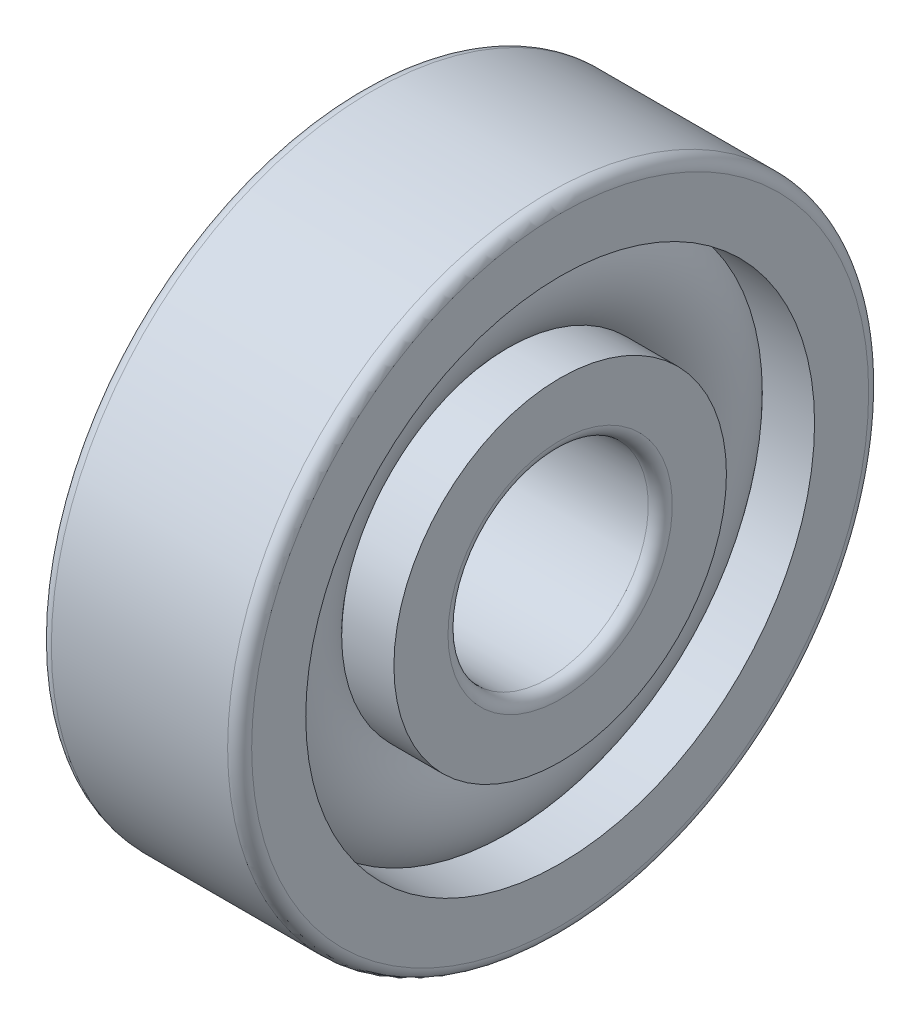
ISO-10303-21;
HEADER;
FILE_DESCRIPTION(('STEP AP214'),'2;1');
FILE_NAME('part.step','',(''),(''),'','','');
FILE_SCHEMA(('AUTOMOTIVE_DESIGN { 1 0 10303 214 1 1 1 1 }'));
ENDSEC;
DATA;
#1=APPLICATION_CONTEXT('core data for automotive mechanical design processes');
#2=APPLICATION_PROTOCOL_DEFINITION('international standard','automotive_design',2000,#1);
#3=PRODUCT_CONTEXT('',#1,'mechanical');
#4=PRODUCT('Part','Part','',(#3));
#5=PRODUCT_RELATED_PRODUCT_CATEGORY('part','',(#4));
#6=PRODUCT_DEFINITION_FORMATION('','',#4);
#7=PRODUCT_DEFINITION_CONTEXT('part definition',#1,'design');
#8=PRODUCT_DEFINITION('design','',#6,#7);
#9=PRODUCT_DEFINITION_SHAPE('','',#8);
#10=(LENGTH_UNIT() NAMED_UNIT(*) SI_UNIT(.MILLI.,.METRE.));
#11=(NAMED_UNIT(*) PLANE_ANGLE_UNIT() SI_UNIT($,.RADIAN.));
#12=(NAMED_UNIT(*) SI_UNIT($,.STERADIAN.) SOLID_ANGLE_UNIT());
#13=UNCERTAINTY_MEASURE_WITH_UNIT(LENGTH_MEASURE(1.E-05),#10,'distance_accuracy_value','');
#14=(GEOMETRIC_REPRESENTATION_CONTEXT(3) GLOBAL_UNCERTAINTY_ASSIGNED_CONTEXT((#13)) GLOBAL_UNIT_ASSIGNED_CONTEXT((#10,
#11,#12)) REPRESENTATION_CONTEXT('',''));
#15=CARTESIAN_POINT('',(0.,0.,0.));
#16=DIRECTION('',(0.,0.,1.));
#17=DIRECTION('',(1.,0.,0.));
#18=AXIS2_PLACEMENT_3D('',#15,#16,#17);
#19=CARTESIAN_POINT('',(0.,0.,0.));
#20=DIRECTION('',(1.,0.,0.));
#21=DIRECTION('',(0.,0.,-1.));
#22=AXIS2_PLACEMENT_3D('',#19,#20,#21);
#23=TOROIDAL_SURFACE('',#22,5.25000000000001,1.625);
#24=CARTESIAN_POINT('',(0.,0.,-6.87500000000001));
#25=VERTEX_POINT('',#24);
#26=VERTEX_LOOP('',#25);
#27=FACE_BOUND('',#26,.T.);
#28=ADVANCED_FACE('F39',(#27),#23,.T.);
#29=OPEN_SHELL('',(#28));
#30=SHELL_BASED_SURFACE_MODEL('B2',(#29));
#31=CARTESIAN_POINT('',(-3.63375179214485,0.,0.));
#32=DIRECTION('',(-1.,0.,0.));
#33=DIRECTION('',(0.,0.,1.));
#34=AXIS2_PLACEMENT_3D('',#31,#32,#33);
#35=CYLINDRICAL_SURFACE('',#34,4.15000000000001);
#36=CARTESIAN_POINT('',(1.19608737139057,0.,0.));
#37=DIRECTION('',(-1.,0.,0.));
#38=DIRECTION('',(0.,0.,1.));
#39=AXIS2_PLACEMENT_3D('',#36,#37,#38);
#40=CIRCLE('',#39,4.15000000000001);
#41=CARTESIAN_POINT('',(1.19608737139057,0.,4.15000000000001));
#42=VERTEX_POINT('',#41);
#43=EDGE_CURVE('E38',#42,#42,#40,.T.);
#44=ORIENTED_EDGE('',*,*,#43,.F.);
#45=EDGE_LOOP('',(#44));
#46=FACE_BOUND('',#45,.T.);
#47=CARTESIAN_POINT('',(2.5,0.,0.));
#48=DIRECTION('',(-1.,0.,0.));
#49=DIRECTION('',(0.,0.,1.));
#50=AXIS2_PLACEMENT_3D('',#47,#48,#49);
#51=CIRCLE('',#50,4.15000000000001);
#52=CARTESIAN_POINT('',(2.5,0.,4.15000000000001));
#53=VERTEX_POINT('',#52);
#54=EDGE_CURVE('E87',#53,#53,#51,.T.);
#55=ORIENTED_EDGE('',*,*,#54,.T.);
#56=EDGE_LOOP('',(#55));
#57=FACE_BOUND('',#56,.T.);
#58=ADVANCED_FACE('F59',(#46,#57),#35,.T.);
#59=CARTESIAN_POINT('',(0.,0.,0.));
#60=DIRECTION('',(-1.,0.,0.));
#61=DIRECTION('',(0.,0.,1.));
#62=AXIS2_PLACEMENT_3D('',#59,#60,#61);
#63=TOROIDAL_SURFACE('',#62,5.25000000000001,1.625);
#64=CARTESIAN_POINT('',(-1.19608737139057,0.,0.));
#65=DIRECTION('',(-1.,0.,0.));
#66=DIRECTION('',(0.,0.,1.));
#67=AXIS2_PLACEMENT_3D('',#64,#65,#66);
#68=CIRCLE('',#67,4.15000000000001);
#69=CARTESIAN_POINT('',(-1.19608737139057,0.,4.15000000000001));
#70=VERTEX_POINT('',#69);
#71=EDGE_CURVE('E65',#70,#70,#68,.T.);
#72=ORIENTED_EDGE('',*,*,#71,.F.);
#73=EDGE_LOOP('',(#72));
#74=FACE_BOUND('',#73,.T.);
#75=ORIENTED_EDGE('',*,*,#43,.T.);
#76=EDGE_LOOP('',(#75));
#77=FACE_BOUND('',#76,.T.);
#78=ADVANCED_FACE('F124',(#74,#77),#63,.F.);
#79=CARTESIAN_POINT('',(-3.63375179214485,0.,0.));
#80=DIRECTION('',(-1.,0.,0.));
#81=DIRECTION('',(0.,0.,1.));
#82=AXIS2_PLACEMENT_3D('',#79,#80,#81);
#83=CYLINDRICAL_SURFACE('',#82,4.15000000000001);
#84=CARTESIAN_POINT('',(-2.5,0.,0.));
#85=DIRECTION('',(-1.,0.,0.));
#86=DIRECTION('',(0.,0.,1.));
#87=AXIS2_PLACEMENT_3D('',#84,#85,#86);
#88=CIRCLE('',#87,4.15000000000001);
#89=CARTESIAN_POINT('',(-2.5,0.,4.15000000000001));
#90=VERTEX_POINT('',#89);
#91=EDGE_CURVE('E69',#90,#90,#88,.T.);
#92=ORIENTED_EDGE('',*,*,#91,.F.);
#93=EDGE_LOOP('',(#92));
#94=FACE_BOUND('',#93,.T.);
#95=ORIENTED_EDGE('',*,*,#71,.T.);
#96=EDGE_LOOP('',(#95));
#97=FACE_BOUND('',#96,.T.);
#98=ADVANCED_FACE('F119',(#94,#97),#83,.T.);
#99=CARTESIAN_POINT('',(-2.5,0.,0.));
#100=DIRECTION('',(1.,0.,0.));
#101=DIRECTION('',(0.,0.,-1.));
#102=AXIS2_PLACEMENT_3D('',#99,#100,#101);
#103=PLANE('',#102);
#104=CARTESIAN_POINT('',(-2.5,0.,0.));
#105=DIRECTION('',(-1.,0.,0.));
#106=DIRECTION('',(0.,0.,1.));
#107=AXIS2_PLACEMENT_3D('',#104,#105,#106);
#108=CIRCLE('',#107,2.80000000000001);
#109=CARTESIAN_POINT('',(-2.5,0.,2.80000000000001));
#110=VERTEX_POINT('',#109);
#111=EDGE_CURVE('E73',#110,#110,#108,.T.);
#112=ORIENTED_EDGE('',*,*,#111,.F.);
#113=EDGE_LOOP('',(#112));
#114=FACE_BOUND('',#113,.T.);
#115=ORIENTED_EDGE('',*,*,#91,.T.);
#116=EDGE_LOOP('',(#115));
#117=FACE_BOUND('',#116,.T.);
#118=ADVANCED_FACE('F113',(#114,#117),#103,.F.);
#119=CARTESIAN_POINT('',(-2.20000000000001,0.,0.));
#120=DIRECTION('',(-1.,0.,0.));
#121=DIRECTION('',(0.,0.,1.));
#122=AXIS2_PLACEMENT_3D('',#119,#120,#121);
#123=TOROIDAL_SURFACE('',#122,2.80000000000001,0.299999999999996);
#124=CARTESIAN_POINT('',(-2.20000000000001,0.,0.));
#125=DIRECTION('',(-1.,0.,0.));
#126=DIRECTION('',(0.,0.,1.));
#127=AXIS2_PLACEMENT_3D('',#124,#125,#126);
#128=CIRCLE('',#127,2.50000000000001);
#129=CARTESIAN_POINT('',(-2.20000000000001,0.,2.50000000000001));
#130=VERTEX_POINT('',#129);
#131=EDGE_CURVE('E78',#130,#130,#128,.T.);
#132=ORIENTED_EDGE('',*,*,#131,.F.);
#133=EDGE_LOOP('',(#132));
#134=FACE_BOUND('',#133,.T.);
#135=ORIENTED_EDGE('',*,*,#111,.T.);
#136=EDGE_LOOP('',(#135));
#137=FACE_BOUND('',#136,.T.);
#138=ADVANCED_FACE('F107',(#134,#137),#123,.T.);
#139=CARTESIAN_POINT('',(-3.63375179214485,0.,0.));
#140=DIRECTION('',(-1.,0.,0.));
#141=DIRECTION('',(0.,0.,1.));
#142=AXIS2_PLACEMENT_3D('',#139,#140,#141);
#143=CYLINDRICAL_SURFACE('',#142,2.50000000000001);
#144=CARTESIAN_POINT('',(2.20000000000001,0.,0.));
#145=DIRECTION('',(-1.,0.,0.));
#146=DIRECTION('',(0.,0.,1.));
#147=AXIS2_PLACEMENT_3D('',#144,#145,#146);
#148=CIRCLE('',#147,2.50000000000001);
#149=CARTESIAN_POINT('',(2.20000000000001,0.,2.50000000000001));
#150=VERTEX_POINT('',#149);
#151=EDGE_CURVE('E81',#150,#150,#148,.T.);
#152=ORIENTED_EDGE('',*,*,#151,.F.);
#153=EDGE_LOOP('',(#152));
#154=FACE_BOUND('',#153,.T.);
#155=ORIENTED_EDGE('',*,*,#131,.T.);
#156=EDGE_LOOP('',(#155));
#157=FACE_BOUND('',#156,.T.);
#158=ADVANCED_FACE('F101',(#154,#157),#143,.F.);
#159=CARTESIAN_POINT('',(2.20000000000001,0.,0.));
#160=DIRECTION('',(-1.,0.,0.));
#161=DIRECTION('',(0.,0.,1.));
#162=AXIS2_PLACEMENT_3D('',#159,#160,#161);
#163=TOROIDAL_SURFACE('',#162,2.80000000000001,0.299999999999996);
#164=CARTESIAN_POINT('',(2.5,0.,0.));
#165=DIRECTION('',(-1.,0.,0.));
#166=DIRECTION('',(0.,0.,1.));
#167=AXIS2_PLACEMENT_3D('',#164,#165,#166);
#168=CIRCLE('',#167,2.80000000000001);
#169=CARTESIAN_POINT('',(2.5,0.,2.80000000000001));
#170=VERTEX_POINT('',#169);
#171=EDGE_CURVE('E84',#170,#170,#168,.T.);
#172=ORIENTED_EDGE('',*,*,#171,.F.);
#173=EDGE_LOOP('',(#172));
#174=FACE_BOUND('',#173,.T.);
#175=ORIENTED_EDGE('',*,*,#151,.T.);
#176=EDGE_LOOP('',(#175));
#177=FACE_BOUND('',#176,.T.);
#178=ADVANCED_FACE('F95',(#174,#177),#163,.T.);
#179=CARTESIAN_POINT('',(2.5,0.,0.));
#180=DIRECTION('',(-1.,0.,0.));
#181=DIRECTION('',(0.,0.,1.));
#182=AXIS2_PLACEMENT_3D('',#179,#180,#181);
#183=PLANE('',#182);
#184=ORIENTED_EDGE('',*,*,#54,.F.);
#185=EDGE_LOOP('',(#184));
#186=FACE_BOUND('',#185,.T.);
#187=ORIENTED_EDGE('',*,*,#171,.T.);
#188=EDGE_LOOP('',(#187));
#189=FACE_BOUND('',#188,.T.);
#190=ADVANCED_FACE('F92',(#186,#189),#183,.F.);
#191=CLOSED_SHELL('',(#58,#78,#98,#118,#138,#158,#178,#190));
#192=MANIFOLD_SOLID_BREP('B6',#191);
#193=CARTESIAN_POINT('',(0.,0.,0.));
#194=DIRECTION('',(-1.,0.,0.));
#195=DIRECTION('',(0.,0.,1.));
#196=AXIS2_PLACEMENT_3D('',#193,#194,#195);
#197=TOROIDAL_SURFACE('',#196,5.25000000000001,1.625);
#198=CARTESIAN_POINT('',(-1.19608737139057,0.,0.));
#199=DIRECTION('',(-1.,0.,0.));
#200=DIRECTION('',(0.,0.,1.));
#201=AXIS2_PLACEMENT_3D('',#198,#199,#200);
#202=CIRCLE('',#201,6.35000000000001);
#203=CARTESIAN_POINT('',(-1.19608737139057,0.,6.35000000000001));
#204=VERTEX_POINT('',#203);
#205=EDGE_CURVE('E209',#204,#204,#202,.T.);
#206=ORIENTED_EDGE('',*,*,#205,.T.);
#207=EDGE_LOOP('',(#206));
#208=FACE_BOUND('',#207,.T.);
#209=CARTESIAN_POINT('',(1.19608737139057,0.,0.));
#210=DIRECTION('',(-1.,0.,0.));
#211=DIRECTION('',(0.,0.,1.));
#212=AXIS2_PLACEMENT_3D('',#209,#210,#211);
#213=CIRCLE('',#212,6.35000000000001);
#214=CARTESIAN_POINT('',(1.19608737139057,0.,6.35000000000001));
#215=VERTEX_POINT('',#214);
#216=EDGE_CURVE('E58',#215,#215,#213,.T.);
#217=ORIENTED_EDGE('',*,*,#216,.F.);
#218=EDGE_LOOP('',(#217));
#219=FACE_BOUND('',#218,.T.);
#220=ADVANCED_FACE('F181',(#208,#219),#197,.F.);
#221=CARTESIAN_POINT('',(-3.63375179214485,0.,0.));
#222=DIRECTION('',(-1.,0.,0.));
#223=DIRECTION('',(0.,0.,1.));
#224=AXIS2_PLACEMENT_3D('',#221,#222,#223);
#225=CYLINDRICAL_SURFACE('',#224,6.35000000000001);
#226=ORIENTED_EDGE('',*,*,#216,.T.);
#227=EDGE_LOOP('',(#226));
#228=FACE_BOUND('',#227,.T.);
#229=CARTESIAN_POINT('',(2.5,0.,0.));
#230=DIRECTION('',(-1.,0.,0.));
#231=DIRECTION('',(0.,0.,1.));
#232=AXIS2_PLACEMENT_3D('',#229,#230,#231);
#233=CIRCLE('',#232,6.35000000000001);
#234=CARTESIAN_POINT('',(2.5,0.,6.35000000000001));
#235=VERTEX_POINT('',#234);
#236=EDGE_CURVE('E187',#235,#235,#233,.T.);
#237=ORIENTED_EDGE('',*,*,#236,.F.);
#238=EDGE_LOOP('',(#237));
#239=FACE_BOUND('',#238,.T.);
#240=ADVANCED_FACE('F227',(#228,#239),#225,.F.);
#241=CARTESIAN_POINT('',(2.5,0.,0.));
#242=DIRECTION('',(1.,0.,0.));
#243=DIRECTION('',(0.,0.,-1.));
#244=AXIS2_PLACEMENT_3D('',#241,#242,#243);
#245=PLANE('',#244);
#246=ORIENTED_EDGE('',*,*,#236,.T.);
#247=EDGE_LOOP('',(#246));
#248=FACE_BOUND('',#247,.T.);
#249=CARTESIAN_POINT('',(2.5,0.,0.));
#250=DIRECTION('',(-1.,0.,0.));
#251=DIRECTION('',(0.,0.,1.));
#252=AXIS2_PLACEMENT_3D('',#249,#250,#251);
#253=CIRCLE('',#252,7.7);
#254=CARTESIAN_POINT('',(2.5,0.,7.7));
#255=VERTEX_POINT('',#254);
#256=EDGE_CURVE('E191',#255,#255,#253,.T.);
#257=ORIENTED_EDGE('',*,*,#256,.F.);
#258=EDGE_LOOP('',(#257));
#259=FACE_BOUND('',#258,.T.);
#260=ADVANCED_FACE('F231',(#248,#259),#245,.T.);
#261=CARTESIAN_POINT('',(2.2,0.,0.));
#262=DIRECTION('',(-1.,0.,0.));
#263=DIRECTION('',(0.,0.,1.));
#264=AXIS2_PLACEMENT_3D('',#261,#262,#263);
#265=TOROIDAL_SURFACE('',#264,7.7,0.300000000000002);
#266=ORIENTED_EDGE('',*,*,#256,.T.);
#267=EDGE_LOOP('',(#266));
#268=FACE_BOUND('',#267,.T.);
#269=CARTESIAN_POINT('',(2.2,0.,0.));
#270=DIRECTION('',(-1.,0.,0.));
#271=DIRECTION('',(0.,0.,1.));
#272=AXIS2_PLACEMENT_3D('',#269,#270,#271);
#273=CIRCLE('',#272,8.);
#274=CARTESIAN_POINT('',(2.2,0.,8.));
#275=VERTEX_POINT('',#274);
#276=EDGE_CURVE('E195',#275,#275,#273,.T.);
#277=ORIENTED_EDGE('',*,*,#276,.F.);
#278=EDGE_LOOP('',(#277));
#279=FACE_BOUND('',#278,.T.);
#280=ADVANCED_FACE('F235',(#268,#279),#265,.T.);
#281=CARTESIAN_POINT('',(-3.63375179214485,0.,0.));
#282=DIRECTION('',(-1.,0.,0.));
#283=DIRECTION('',(0.,0.,1.));
#284=AXIS2_PLACEMENT_3D('',#281,#282,#283);
#285=CYLINDRICAL_SURFACE('',#284,8.);
#286=ORIENTED_EDGE('',*,*,#276,.T.);
#287=EDGE_LOOP('',(#286));
#288=FACE_BOUND('',#287,.T.);
#289=CARTESIAN_POINT('',(-2.2,0.,0.));
#290=DIRECTION('',(-1.,0.,0.));
#291=DIRECTION('',(0.,0.,1.));
#292=AXIS2_PLACEMENT_3D('',#289,#290,#291);
#293=CIRCLE('',#292,8.);
#294=CARTESIAN_POINT('',(-2.2,0.,8.));
#295=VERTEX_POINT('',#294);
#296=EDGE_CURVE('E200',#295,#295,#293,.T.);
#297=ORIENTED_EDGE('',*,*,#296,.F.);
#298=EDGE_LOOP('',(#297));
#299=FACE_BOUND('',#298,.T.);
#300=ADVANCED_FACE('F241',(#288,#299),#285,.T.);
#301=CARTESIAN_POINT('',(-2.2,0.,0.));
#302=DIRECTION('',(-1.,0.,0.));
#303=DIRECTION('',(0.,0.,1.));
#304=AXIS2_PLACEMENT_3D('',#301,#302,#303);
#305=TOROIDAL_SURFACE('',#304,7.7,0.300000000000002);
#306=ORIENTED_EDGE('',*,*,#296,.T.);
#307=EDGE_LOOP('',(#306));
#308=FACE_BOUND('',#307,.T.);
#309=CARTESIAN_POINT('',(-2.5,0.,0.));
#310=DIRECTION('',(-1.,0.,0.));
#311=DIRECTION('',(0.,0.,1.));
#312=AXIS2_PLACEMENT_3D('',#309,#310,#311);
#313=CIRCLE('',#312,7.7);
#314=CARTESIAN_POINT('',(-2.5,0.,7.7));
#315=VERTEX_POINT('',#314);
#316=EDGE_CURVE('E203',#315,#315,#313,.T.);
#317=ORIENTED_EDGE('',*,*,#316,.F.);
#318=EDGE_LOOP('',(#317));
#319=FACE_BOUND('',#318,.T.);
#320=ADVANCED_FACE('F223',(#308,#319),#305,.T.);
#321=CARTESIAN_POINT('',(-2.5,0.,0.));
#322=DIRECTION('',(-1.,0.,0.));
#323=DIRECTION('',(0.,0.,1.));
#324=AXIS2_PLACEMENT_3D('',#321,#322,#323);
#325=PLANE('',#324);
#326=ORIENTED_EDGE('',*,*,#316,.T.);
#327=EDGE_LOOP('',(#326));
#328=FACE_BOUND('',#327,.T.);
#329=CARTESIAN_POINT('',(-2.5,0.,0.));
#330=DIRECTION('',(-1.,0.,0.));
#331=DIRECTION('',(0.,0.,1.));
#332=AXIS2_PLACEMENT_3D('',#329,#330,#331);
#333=CIRCLE('',#332,6.35000000000001);
#334=CARTESIAN_POINT('',(-2.5,0.,6.35000000000001));
#335=VERTEX_POINT('',#334);
#336=EDGE_CURVE('E206',#335,#335,#333,.T.);
#337=ORIENTED_EDGE('',*,*,#336,.F.);
#338=EDGE_LOOP('',(#337));
#339=FACE_BOUND('',#338,.T.);
#340=ADVANCED_FACE('F217',(#328,#339),#325,.T.);
#341=CARTESIAN_POINT('',(-3.63375179214485,0.,0.));
#342=DIRECTION('',(-1.,0.,0.));
#343=DIRECTION('',(0.,0.,1.));
#344=AXIS2_PLACEMENT_3D('',#341,#342,#343);
#345=CYLINDRICAL_SURFACE('',#344,6.35000000000001);
#346=ORIENTED_EDGE('',*,*,#336,.T.);
#347=EDGE_LOOP('',(#346));
#348=FACE_BOUND('',#347,.T.);
#349=ORIENTED_EDGE('',*,*,#205,.F.);
#350=EDGE_LOOP('',(#349));
#351=FACE_BOUND('',#350,.T.);
#352=ADVANCED_FACE('F215',(#348,#351),#345,.F.);
#353=CLOSED_SHELL('',(#220,#240,#260,#280,#300,#320,#340,#352));
#354=MANIFOLD_SOLID_BREP('B33',#353);
#355=ADVANCED_BREP_SHAPE_REPRESENTATION('',(#18,#192,#354),#14);
#356=MANIFOLD_SURFACE_SHAPE_REPRESENTATION('',(#18,#30),#14);
#357=SHAPE_REPRESENTATION('',(#18),#14);
#358=SHAPE_DEFINITION_REPRESENTATION(#9,#357);
#359=SHAPE_REPRESENTATION_RELATIONSHIP('','',#357,#355);
#360=SHAPE_REPRESENTATION_RELATIONSHIP('','',#357,#356);
ENDSEC;
END-ISO-10303-21;
